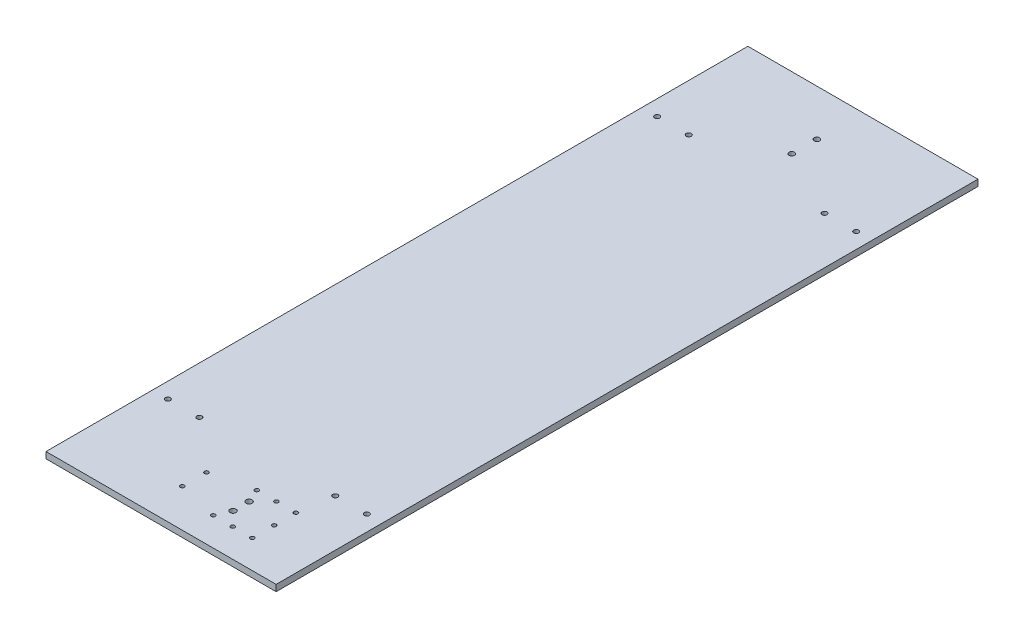
ISO-10303-21;
HEADER;
FILE_DESCRIPTION(('STEP AP214'),'2;1');
FILE_NAME('part.step','',(''),(''),'','','');
FILE_SCHEMA(('AUTOMOTIVE_DESIGN { 1 0 10303 214 1 1 1 1 }'));
ENDSEC;
DATA;
#1=APPLICATION_CONTEXT('core data for automotive mechanical design processes');
#2=APPLICATION_PROTOCOL_DEFINITION('international standard','automotive_design',2000,#1);
#3=PRODUCT_CONTEXT('',#1,'mechanical');
#4=PRODUCT('Part','Part','',(#3));
#5=PRODUCT_RELATED_PRODUCT_CATEGORY('part','',(#4));
#6=PRODUCT_DEFINITION_FORMATION('','',#4);
#7=PRODUCT_DEFINITION_CONTEXT('part definition',#1,'design');
#8=PRODUCT_DEFINITION('design','',#6,#7);
#9=PRODUCT_DEFINITION_SHAPE('','',#8);
#10=(LENGTH_UNIT() NAMED_UNIT(*) SI_UNIT(.MILLI.,.METRE.));
#11=(NAMED_UNIT(*) PLANE_ANGLE_UNIT() SI_UNIT($,.RADIAN.));
#12=(NAMED_UNIT(*) SI_UNIT($,.STERADIAN.) SOLID_ANGLE_UNIT());
#13=UNCERTAINTY_MEASURE_WITH_UNIT(LENGTH_MEASURE(1.E-05),#10,'distance_accuracy_value','');
#14=(GEOMETRIC_REPRESENTATION_CONTEXT(3) GLOBAL_UNCERTAINTY_ASSIGNED_CONTEXT((#13)) GLOBAL_UNIT_ASSIGNED_CONTEXT((#10,
#11,#12)) REPRESENTATION_CONTEXT('',''));
#15=CARTESIAN_POINT('',(0.,0.,0.));
#16=DIRECTION('',(0.,0.,1.));
#17=DIRECTION('',(1.,0.,0.));
#18=AXIS2_PLACEMENT_3D('',#15,#16,#17);
#19=CARTESIAN_POINT('',(-114.75,6.35,-350.));
#20=DIRECTION('',(1.,0.,0.));
#21=DIRECTION('',(0.,0.,-1.));
#22=AXIS2_PLACEMENT_3D('',#19,#20,#21);
#23=PLANE('',#22);
#24=DIRECTION('',(0.,0.,1.));
#25=VECTOR('',#24,1.);
#26=CARTESIAN_POINT('',(-114.75,0.,-350.));
#27=LINE('',#26,#25);
#28=CARTESIAN_POINT('',(-114.75,0.,-350.));
#29=VERTEX_POINT('',#28);
#30=CARTESIAN_POINT('',(-114.75,0.,350.));
#31=VERTEX_POINT('',#30);
#32=EDGE_CURVE('E97',#29,#31,#27,.T.);
#33=ORIENTED_EDGE('',*,*,#32,.T.);
#34=DIRECTION('',(0.,-1.,0.));
#35=VECTOR('',#34,1.);
#36=CARTESIAN_POINT('',(-114.75,6.35,350.));
#37=LINE('',#36,#35);
#38=CARTESIAN_POINT('',(-114.75,6.35,350.));
#39=VERTEX_POINT('',#38);
#40=EDGE_CURVE('E11',#39,#31,#37,.T.);
#41=ORIENTED_EDGE('',*,*,#40,.F.);
#42=DIRECTION('',(0.,0.,1.));
#43=VECTOR('',#42,1.);
#44=CARTESIAN_POINT('',(-114.75,6.35,-350.));
#45=LINE('',#44,#43);
#46=CARTESIAN_POINT('',(-114.75,6.35,-350.));
#47=VERTEX_POINT('',#46);
#48=EDGE_CURVE('E85',#47,#39,#45,.T.);
#49=ORIENTED_EDGE('',*,*,#48,.F.);
#50=DIRECTION('',(0.,-1.,0.));
#51=VECTOR('',#50,1.);
#52=CARTESIAN_POINT('',(-114.75,6.35,-350.));
#53=LINE('',#52,#51);
#54=EDGE_CURVE('E93',#47,#29,#53,.T.);
#55=ORIENTED_EDGE('',*,*,#54,.T.);
#56=EDGE_LOOP('',(#33,#41,#49,#55));
#57=FACE_BOUND('',#56,.T.);
#58=ADVANCED_FACE('F34',(#57),#23,.F.);
#59=CARTESIAN_POINT('',(114.75,6.35,350.));
#60=DIRECTION('',(0.,0.,-1.));
#61=DIRECTION('',(-1.,0.,0.));
#62=AXIS2_PLACEMENT_3D('',#59,#60,#61);
#63=PLANE('',#62);
#64=DIRECTION('',(1.,0.,0.));
#65=VECTOR('',#64,1.);
#66=CARTESIAN_POINT('',(114.75,0.,350.));
#67=LINE('',#66,#65);
#68=CARTESIAN_POINT('',(114.75,0.,350.));
#69=VERTEX_POINT('',#68);
#70=EDGE_CURVE('E89',#31,#69,#67,.T.);
#71=ORIENTED_EDGE('',*,*,#70,.T.);
#72=DIRECTION('',(0.,-1.,0.));
#73=VECTOR('',#72,1.);
#74=CARTESIAN_POINT('',(114.75,6.35,350.));
#75=LINE('',#74,#73);
#76=CARTESIAN_POINT('',(114.75,6.35,350.));
#77=VERTEX_POINT('',#76);
#78=EDGE_CURVE('E42',#77,#69,#75,.T.);
#79=ORIENTED_EDGE('',*,*,#78,.F.);
#80=DIRECTION('',(1.,0.,0.));
#81=VECTOR('',#80,1.);
#82=CARTESIAN_POINT('',(114.75,6.35,350.));
#83=LINE('',#82,#81);
#84=EDGE_CURVE('E80',#39,#77,#83,.T.);
#85=ORIENTED_EDGE('',*,*,#84,.F.);
#86=ORIENTED_EDGE('',*,*,#40,.T.);
#87=EDGE_LOOP('',(#71,#79,#85,#86));
#88=FACE_BOUND('',#87,.T.);
#89=ADVANCED_FACE('F88',(#88),#63,.F.);
#90=CARTESIAN_POINT('',(114.75,6.35,-350.));
#91=DIRECTION('',(-1.,0.,0.));
#92=DIRECTION('',(0.,0.,1.));
#93=AXIS2_PLACEMENT_3D('',#90,#91,#92);
#94=PLANE('',#93);
#95=DIRECTION('',(0.,0.,-1.));
#96=VECTOR('',#95,1.);
#97=CARTESIAN_POINT('',(114.75,0.,-350.));
#98=LINE('',#97,#96);
#99=CARTESIAN_POINT('',(114.75,0.,-350.));
#100=VERTEX_POINT('',#99);
#101=EDGE_CURVE('E67',#69,#100,#98,.T.);
#102=ORIENTED_EDGE('',*,*,#101,.T.);
#103=DIRECTION('',(0.,-1.,0.));
#104=VECTOR('',#103,1.);
#105=CARTESIAN_POINT('',(114.75,6.35,-350.));
#106=LINE('',#105,#104);
#107=CARTESIAN_POINT('',(114.75,6.35,-350.));
#108=VERTEX_POINT('',#107);
#109=EDGE_CURVE('E90',#108,#100,#106,.T.);
#110=ORIENTED_EDGE('',*,*,#109,.F.);
#111=DIRECTION('',(0.,0.,-1.));
#112=VECTOR('',#111,1.);
#113=CARTESIAN_POINT('',(114.75,6.35,-350.));
#114=LINE('',#113,#112);
#115=EDGE_CURVE('E83',#77,#108,#114,.T.);
#116=ORIENTED_EDGE('',*,*,#115,.F.);
#117=ORIENTED_EDGE('',*,*,#78,.T.);
#118=EDGE_LOOP('',(#102,#110,#116,#117));
#119=FACE_BOUND('',#118,.T.);
#120=ADVANCED_FACE('F91',(#119),#94,.F.);
#121=CARTESIAN_POINT('',(114.75,6.35,-350.));
#122=DIRECTION('',(0.,0.,1.));
#123=DIRECTION('',(1.,0.,0.));
#124=AXIS2_PLACEMENT_3D('',#121,#122,#123);
#125=PLANE('',#124);
#126=DIRECTION('',(-1.,0.,0.));
#127=VECTOR('',#126,1.);
#128=CARTESIAN_POINT('',(114.75,0.,-350.));
#129=LINE('',#128,#127);
#130=EDGE_CURVE('E73',#100,#29,#129,.T.);
#131=ORIENTED_EDGE('',*,*,#130,.T.);
#132=ORIENTED_EDGE('',*,*,#54,.F.);
#133=DIRECTION('',(-1.,0.,0.));
#134=VECTOR('',#133,1.);
#135=CARTESIAN_POINT('',(114.75,6.35,-350.));
#136=LINE('',#135,#134);
#137=EDGE_CURVE('E50',#108,#47,#136,.T.);
#138=ORIENTED_EDGE('',*,*,#137,.F.);
#139=ORIENTED_EDGE('',*,*,#109,.T.);
#140=EDGE_LOOP('',(#131,#132,#138,#139));
#141=FACE_BOUND('',#140,.T.);
#142=ADVANCED_FACE('F105',(#141),#125,.F.);
#143=CARTESIAN_POINT('',(0.,6.35,0.));
#144=DIRECTION('',(0.,-1.,0.));
#145=DIRECTION('',(0.,0.,-1.));
#146=AXIS2_PLACEMENT_3D('',#143,#144,#145);
#147=PLANE('',#146);
#148=CARTESIAN_POINT('',(0.,6.35,-279.));
#149=DIRECTION('',(0.,1.,0.));
#150=DIRECTION('',(0.,0.,1.));
#151=AXIS2_PLACEMENT_3D('',#148,#149,#150);
#152=CIRCLE('',#151,2.75);
#153=CARTESIAN_POINT('',(0.,6.35,-276.25));
#154=VERTEX_POINT('',#153);
#155=EDGE_CURVE('E231',#154,#154,#152,.T.);
#156=ORIENTED_EDGE('',*,*,#155,.F.);
#157=EDGE_LOOP('',(#156));
#158=FACE_BOUND('',#157,.T.);
#159=CARTESIAN_POINT('',(0.,6.35,-304.));
#160=DIRECTION('',(0.,1.,0.));
#161=DIRECTION('',(0.,0.,1.));
#162=AXIS2_PLACEMENT_3D('',#159,#160,#161);
#163=CIRCLE('',#162,2.75);
#164=CARTESIAN_POINT('',(0.,6.35,-301.25));
#165=VERTEX_POINT('',#164);
#166=EDGE_CURVE('E225',#165,#165,#163,.T.);
#167=ORIENTED_EDGE('',*,*,#166,.F.);
#168=EDGE_LOOP('',(#167));
#169=FACE_BOUND('',#168,.T.);
#170=CARTESIAN_POINT('',(-67.7499999999988,6.35,-244.));
#171=DIRECTION('',(0.,-1.,0.));
#172=DIRECTION('',(0.,0.,-1.));
#173=AXIS2_PLACEMENT_3D('',#170,#171,#172);
#174=CIRCLE('',#173,2.5);
#175=CARTESIAN_POINT('',(-67.7499999999988,6.35,-246.5));
#176=VERTEX_POINT('',#175);
#177=EDGE_CURVE('E168',#176,#176,#174,.T.);
#178=ORIENTED_EDGE('',*,*,#177,.T.);
#179=EDGE_LOOP('',(#178));
#180=FACE_BOUND('',#179,.T.);
#181=CARTESIAN_POINT('',(-99.2499999999988,6.35,-244.));
#182=DIRECTION('',(0.,-1.,0.));
#183=DIRECTION('',(0.,0.,-1.));
#184=AXIS2_PLACEMENT_3D('',#181,#182,#183);
#185=CIRCLE('',#184,2.50000000000001);
#186=CARTESIAN_POINT('',(-99.2499999999988,6.35,-246.5));
#187=VERTEX_POINT('',#186);
#188=EDGE_CURVE('E175',#187,#187,#185,.T.);
#189=ORIENTED_EDGE('',*,*,#188,.T.);
#190=EDGE_LOOP('',(#189));
#191=FACE_BOUND('',#190,.T.);
#192=CARTESIAN_POINT('',(99.2499999999988,6.35,-244.));
#193=DIRECTION('',(0.,-1.,0.));
#194=DIRECTION('',(0.,0.,1.));
#195=AXIS2_PLACEMENT_3D('',#192,#193,#194);
#196=CIRCLE('',#195,2.50000000000001);
#197=CARTESIAN_POINT('',(99.2499999999988,6.35,-241.5));
#198=VERTEX_POINT('',#197);
#199=EDGE_CURVE('E181',#198,#198,#196,.T.);
#200=ORIENTED_EDGE('',*,*,#199,.T.);
#201=EDGE_LOOP('',(#200));
#202=FACE_BOUND('',#201,.T.);
#203=CARTESIAN_POINT('',(67.7499999999988,6.35,-244.));
#204=DIRECTION('',(0.,-1.,0.));
#205=DIRECTION('',(0.,0.,1.));
#206=AXIS2_PLACEMENT_3D('',#203,#204,#205);
#207=CIRCLE('',#206,2.5);
#208=CARTESIAN_POINT('',(67.7499999999988,6.35,-241.5));
#209=VERTEX_POINT('',#208);
#210=EDGE_CURVE('E187',#209,#209,#207,.T.);
#211=ORIENTED_EDGE('',*,*,#210,.T.);
#212=EDGE_LOOP('',(#211));
#213=FACE_BOUND('',#212,.T.);
#214=CARTESIAN_POINT('',(99.2499999999988,6.35,244.));
#215=DIRECTION('',(0.,-1.,0.));
#216=DIRECTION('',(0.,0.,-1.));
#217=AXIS2_PLACEMENT_3D('',#214,#215,#216);
#218=CIRCLE('',#217,2.50000000000001);
#219=CARTESIAN_POINT('',(99.2499999999988,6.35,241.5));
#220=VERTEX_POINT('',#219);
#221=EDGE_CURVE('E193',#220,#220,#218,.T.);
#222=ORIENTED_EDGE('',*,*,#221,.T.);
#223=EDGE_LOOP('',(#222));
#224=FACE_BOUND('',#223,.T.);
#225=CARTESIAN_POINT('',(67.7499999999988,6.35,244.));
#226=DIRECTION('',(0.,-1.,0.));
#227=DIRECTION('',(0.,0.,-1.));
#228=AXIS2_PLACEMENT_3D('',#225,#226,#227);
#229=CIRCLE('',#228,2.5);
#230=CARTESIAN_POINT('',(67.7499999999988,6.35,241.5));
#231=VERTEX_POINT('',#230);
#232=EDGE_CURVE('E199',#231,#231,#229,.T.);
#233=ORIENTED_EDGE('',*,*,#232,.T.);
#234=EDGE_LOOP('',(#233));
#235=FACE_BOUND('',#234,.T.);
#236=CARTESIAN_POINT('',(29.75,6.35,308.));
#237=DIRECTION('',(0.,-1.,0.));
#238=DIRECTION('',(0.,0.,-1.));
#239=AXIS2_PLACEMENT_3D('',#236,#237,#238);
#240=CIRCLE('',#239,3.);
#241=CARTESIAN_POINT('',(29.75,6.35,305.));
#242=VERTEX_POINT('',#241);
#243=EDGE_CURVE('E205',#242,#242,#240,.T.);
#244=ORIENTED_EDGE('',*,*,#243,.T.);
#245=EDGE_LOOP('',(#244));
#246=FACE_BOUND('',#245,.T.);
#247=CARTESIAN_POINT('',(29.75,6.35,292.));
#248=DIRECTION('',(0.,-1.,0.));
#249=DIRECTION('',(0.,0.,-1.));
#250=AXIS2_PLACEMENT_3D('',#247,#248,#249);
#251=CIRCLE('',#250,3.00000000000001);
#252=CARTESIAN_POINT('',(29.75,6.35,289.));
#253=VERTEX_POINT('',#252);
#254=EDGE_CURVE('E145',#253,#253,#251,.T.);
#255=ORIENTED_EDGE('',*,*,#254,.T.);
#256=EDGE_LOOP('',(#255));
#257=FACE_BOUND('',#256,.T.);
#258=CARTESIAN_POINT('',(-16.75,6.35,288.));
#259=DIRECTION('',(0.,-1.,0.));
#260=DIRECTION('',(0.,0.,-1.));
#261=AXIS2_PLACEMENT_3D('',#258,#259,#260);
#262=CIRCLE('',#261,2.);
#263=CARTESIAN_POINT('',(-16.75,6.35,286.));
#264=VERTEX_POINT('',#263);
#265=EDGE_CURVE('E114',#264,#264,#262,.T.);
#266=ORIENTED_EDGE('',*,*,#265,.T.);
#267=EDGE_LOOP('',(#266));
#268=FACE_BOUND('',#267,.T.);
#269=CARTESIAN_POINT('',(23.75,6.35,321.75));
#270=DIRECTION('',(0.,-1.,0.));
#271=DIRECTION('',(0.,0.,-1.));
#272=AXIS2_PLACEMENT_3D('',#269,#270,#271);
#273=CIRCLE('',#272,2.);
#274=CARTESIAN_POINT('',(23.75,6.35,319.75));
#275=VERTEX_POINT('',#274);
#276=EDGE_CURVE('E133',#275,#275,#273,.T.);
#277=ORIENTED_EDGE('',*,*,#276,.T.);
#278=EDGE_LOOP('',(#277));
#279=FACE_BOUND('',#278,.T.);
#280=CARTESIAN_POINT('',(23.75,6.35,278.25));
#281=DIRECTION('',(0.,-1.,0.));
#282=DIRECTION('',(0.,0.,-1.));
#283=AXIS2_PLACEMENT_3D('',#280,#281,#282);
#284=CIRCLE('',#283,2.);
#285=CARTESIAN_POINT('',(23.75,6.35,276.25));
#286=VERTEX_POINT('',#285);
#287=EDGE_CURVE('E127',#286,#286,#284,.T.);
#288=ORIENTED_EDGE('',*,*,#287,.T.);
#289=EDGE_LOOP('',(#288));
#290=FACE_BOUND('',#289,.T.);
#291=CARTESIAN_POINT('',(43.25,6.35,278.25));
#292=DIRECTION('',(0.,-1.,0.));
#293=DIRECTION('',(0.,0.,-1.));
#294=AXIS2_PLACEMENT_3D('',#291,#292,#293);
#295=CIRCLE('',#294,2.00000000000002);
#296=CARTESIAN_POINT('',(43.25,6.35,276.25));
#297=VERTEX_POINT('',#296);
#298=EDGE_CURVE('E120',#297,#297,#295,.T.);
#299=ORIENTED_EDGE('',*,*,#298,.T.);
#300=EDGE_LOOP('',(#299));
#301=FACE_BOUND('',#300,.T.);
#302=CARTESIAN_POINT('',(43.25,6.35,321.75));
#303=DIRECTION('',(0.,-1.,0.));
#304=DIRECTION('',(0.,0.,-1.));
#305=AXIS2_PLACEMENT_3D('',#302,#303,#304);
#306=CIRCLE('',#305,2.);
#307=CARTESIAN_POINT('',(43.25,6.35,319.75));
#308=VERTEX_POINT('',#307);
#309=EDGE_CURVE('E121',#308,#308,#306,.T.);
#310=ORIENTED_EDGE('',*,*,#309,.T.);
#311=EDGE_LOOP('',(#310));
#312=FACE_BOUND('',#311,.T.);
#313=CARTESIAN_POINT('',(62.75,6.35,321.75));
#314=DIRECTION('',(0.,-1.,0.));
#315=DIRECTION('',(0.,0.,-1.));
#316=AXIS2_PLACEMENT_3D('',#313,#314,#315);
#317=CIRCLE('',#316,1.99999999999998);
#318=CARTESIAN_POINT('',(62.75,6.35,319.75));
#319=VERTEX_POINT('',#318);
#320=EDGE_CURVE('E157',#319,#319,#317,.T.);
#321=ORIENTED_EDGE('',*,*,#320,.T.);
#322=EDGE_LOOP('',(#321));
#323=FACE_BOUND('',#322,.T.);
#324=CARTESIAN_POINT('',(62.75,6.35,300.));
#325=DIRECTION('',(0.,-1.,0.));
#326=DIRECTION('',(0.,0.,-1.));
#327=AXIS2_PLACEMENT_3D('',#324,#325,#326);
#328=CIRCLE('',#327,2.00000000000001);
#329=CARTESIAN_POINT('',(62.75,6.35,298.));
#330=VERTEX_POINT('',#329);
#331=EDGE_CURVE('E151',#330,#330,#328,.T.);
#332=ORIENTED_EDGE('',*,*,#331,.T.);
#333=EDGE_LOOP('',(#332));
#334=FACE_BOUND('',#333,.T.);
#335=CARTESIAN_POINT('',(62.75,6.35,278.25));
#336=DIRECTION('',(0.,-1.,0.));
#337=DIRECTION('',(0.,0.,-1.));
#338=AXIS2_PLACEMENT_3D('',#335,#336,#337);
#339=CIRCLE('',#338,2.);
#340=CARTESIAN_POINT('',(62.75,6.35,276.25));
#341=VERTEX_POINT('',#340);
#342=EDGE_CURVE('E144',#341,#341,#339,.T.);
#343=ORIENTED_EDGE('',*,*,#342,.T.);
#344=EDGE_LOOP('',(#343));
#345=FACE_BOUND('',#344,.T.);
#346=CARTESIAN_POINT('',(-99.2499999999988,6.35,244.));
#347=DIRECTION('',(0.,-1.,0.));
#348=DIRECTION('',(0.,0.,1.));
#349=AXIS2_PLACEMENT_3D('',#346,#347,#348);
#350=CIRCLE('',#349,2.50000000000001);
#351=CARTESIAN_POINT('',(-99.2499999999988,6.35,246.5));
#352=VERTEX_POINT('',#351);
#353=EDGE_CURVE('E169',#352,#352,#350,.T.);
#354=ORIENTED_EDGE('',*,*,#353,.T.);
#355=EDGE_LOOP('',(#354));
#356=FACE_BOUND('',#355,.T.);
#357=CARTESIAN_POINT('',(-67.7499999999988,6.35,244.));
#358=DIRECTION('',(0.,-1.,0.));
#359=DIRECTION('',(0.,0.,1.));
#360=AXIS2_PLACEMENT_3D('',#357,#358,#359);
#361=CIRCLE('',#360,2.5);
#362=CARTESIAN_POINT('',(-67.7499999999988,6.35,246.5));
#363=VERTEX_POINT('',#362);
#364=EDGE_CURVE('E216',#363,#363,#361,.T.);
#365=ORIENTED_EDGE('',*,*,#364,.T.);
#366=EDGE_LOOP('',(#365));
#367=FACE_BOUND('',#366,.T.);
#368=CARTESIAN_POINT('',(-16.75,6.35,312.));
#369=DIRECTION('',(0.,-1.,0.));
#370=DIRECTION('',(0.,0.,-1.));
#371=AXIS2_PLACEMENT_3D('',#368,#369,#370);
#372=CIRCLE('',#371,2.);
#373=CARTESIAN_POINT('',(-16.75,6.35,310.));
#374=VERTEX_POINT('',#373);
#375=EDGE_CURVE('E100',#374,#374,#372,.T.);
#376=ORIENTED_EDGE('',*,*,#375,.T.);
#377=EDGE_LOOP('',(#376));
#378=FACE_BOUND('',#377,.T.);
#379=ORIENTED_EDGE('',*,*,#48,.T.);
#380=ORIENTED_EDGE('',*,*,#84,.T.);
#381=ORIENTED_EDGE('',*,*,#115,.T.);
#382=ORIENTED_EDGE('',*,*,#137,.T.);
#383=EDGE_LOOP('',(#379,#380,#381,#382));
#384=FACE_BOUND('',#383,.T.);
#385=ADVANCED_FACE('F81',(#158,#169,#180,#191,#202,#213,#224,#235,#246,#257,#268,#279,#290,#301,
#312,#323,#334,#345,#356,#367,#378,#384),#147,.F.);
#386=CARTESIAN_POINT('',(0.,0.,0.));
#387=DIRECTION('',(0.,-1.,0.));
#388=DIRECTION('',(0.,0.,-1.));
#389=AXIS2_PLACEMENT_3D('',#386,#387,#388);
#390=PLANE('',#389);
#391=CARTESIAN_POINT('',(0.,0.,-279.));
#392=DIRECTION('',(0.,1.,0.));
#393=DIRECTION('',(0.,0.,1.));
#394=AXIS2_PLACEMENT_3D('',#391,#392,#393);
#395=CIRCLE('',#394,2.75);
#396=CARTESIAN_POINT('',(0.,0.,-276.25));
#397=VERTEX_POINT('',#396);
#398=EDGE_CURVE('E217',#397,#397,#395,.T.);
#399=ORIENTED_EDGE('',*,*,#398,.T.);
#400=EDGE_LOOP('',(#399));
#401=FACE_BOUND('',#400,.T.);
#402=CARTESIAN_POINT('',(0.,0.,-304.));
#403=DIRECTION('',(0.,1.,0.));
#404=DIRECTION('',(0.,0.,1.));
#405=AXIS2_PLACEMENT_3D('',#402,#403,#404);
#406=CIRCLE('',#405,2.75);
#407=CARTESIAN_POINT('',(0.,0.,-301.25));
#408=VERTEX_POINT('',#407);
#409=EDGE_CURVE('E228',#408,#408,#406,.T.);
#410=ORIENTED_EDGE('',*,*,#409,.T.);
#411=EDGE_LOOP('',(#410));
#412=FACE_BOUND('',#411,.T.);
#413=CARTESIAN_POINT('',(-67.7499999999988,0.,-244.));
#414=DIRECTION('',(0.,-1.,0.));
#415=DIRECTION('',(0.,0.,-1.));
#416=AXIS2_PLACEMENT_3D('',#413,#414,#415);
#417=CIRCLE('',#416,2.5);
#418=CARTESIAN_POINT('',(-67.7499999999988,0.,-246.5));
#419=VERTEX_POINT('',#418);
#420=EDGE_CURVE('E165',#419,#419,#417,.T.);
#421=ORIENTED_EDGE('',*,*,#420,.F.);
#422=EDGE_LOOP('',(#421));
#423=FACE_BOUND('',#422,.T.);
#424=CARTESIAN_POINT('',(-99.2499999999988,0.,-244.));
#425=DIRECTION('',(0.,-1.,0.));
#426=DIRECTION('',(0.,0.,-1.));
#427=AXIS2_PLACEMENT_3D('',#424,#425,#426);
#428=CIRCLE('',#427,2.50000000000001);
#429=CARTESIAN_POINT('',(-99.2499999999988,0.,-246.5));
#430=VERTEX_POINT('',#429);
#431=EDGE_CURVE('E172',#430,#430,#428,.T.);
#432=ORIENTED_EDGE('',*,*,#431,.F.);
#433=EDGE_LOOP('',(#432));
#434=FACE_BOUND('',#433,.T.);
#435=CARTESIAN_POINT('',(99.2499999999988,0.,-244.));
#436=DIRECTION('',(0.,-1.,0.));
#437=DIRECTION('',(0.,0.,1.));
#438=AXIS2_PLACEMENT_3D('',#435,#436,#437);
#439=CIRCLE('',#438,2.50000000000001);
#440=CARTESIAN_POINT('',(99.2499999999988,0.,-241.5));
#441=VERTEX_POINT('',#440);
#442=EDGE_CURVE('E178',#441,#441,#439,.T.);
#443=ORIENTED_EDGE('',*,*,#442,.F.);
#444=EDGE_LOOP('',(#443));
#445=FACE_BOUND('',#444,.T.);
#446=CARTESIAN_POINT('',(67.7499999999988,0.,-244.));
#447=DIRECTION('',(0.,-1.,0.));
#448=DIRECTION('',(0.,0.,1.));
#449=AXIS2_PLACEMENT_3D('',#446,#447,#448);
#450=CIRCLE('',#449,2.5);
#451=CARTESIAN_POINT('',(67.7499999999988,0.,-241.5));
#452=VERTEX_POINT('',#451);
#453=EDGE_CURVE('E184',#452,#452,#450,.T.);
#454=ORIENTED_EDGE('',*,*,#453,.F.);
#455=EDGE_LOOP('',(#454));
#456=FACE_BOUND('',#455,.T.);
#457=CARTESIAN_POINT('',(99.2499999999988,0.,244.));
#458=DIRECTION('',(0.,-1.,0.));
#459=DIRECTION('',(0.,0.,-1.));
#460=AXIS2_PLACEMENT_3D('',#457,#458,#459);
#461=CIRCLE('',#460,2.50000000000001);
#462=CARTESIAN_POINT('',(99.2499999999988,0.,241.5));
#463=VERTEX_POINT('',#462);
#464=EDGE_CURVE('E190',#463,#463,#461,.T.);
#465=ORIENTED_EDGE('',*,*,#464,.F.);
#466=EDGE_LOOP('',(#465));
#467=FACE_BOUND('',#466,.T.);
#468=CARTESIAN_POINT('',(67.7499999999988,0.,244.));
#469=DIRECTION('',(0.,-1.,0.));
#470=DIRECTION('',(0.,0.,-1.));
#471=AXIS2_PLACEMENT_3D('',#468,#469,#470);
#472=CIRCLE('',#471,2.5);
#473=CARTESIAN_POINT('',(67.7499999999988,0.,241.5));
#474=VERTEX_POINT('',#473);
#475=EDGE_CURVE('E196',#474,#474,#472,.T.);
#476=ORIENTED_EDGE('',*,*,#475,.F.);
#477=EDGE_LOOP('',(#476));
#478=FACE_BOUND('',#477,.T.);
#479=CARTESIAN_POINT('',(29.75,0.,308.));
#480=DIRECTION('',(0.,-1.,0.));
#481=DIRECTION('',(0.,0.,-1.));
#482=AXIS2_PLACEMENT_3D('',#479,#480,#481);
#483=CIRCLE('',#482,3.);
#484=CARTESIAN_POINT('',(29.75,0.,305.));
#485=VERTEX_POINT('',#484);
#486=EDGE_CURVE('E202',#485,#485,#483,.T.);
#487=ORIENTED_EDGE('',*,*,#486,.F.);
#488=EDGE_LOOP('',(#487));
#489=FACE_BOUND('',#488,.T.);
#490=CARTESIAN_POINT('',(29.75,0.,292.));
#491=DIRECTION('',(0.,-1.,0.));
#492=DIRECTION('',(0.,0.,-1.));
#493=AXIS2_PLACEMENT_3D('',#490,#491,#492);
#494=CIRCLE('',#493,3.00000000000001);
#495=CARTESIAN_POINT('',(29.75,0.,289.));
#496=VERTEX_POINT('',#495);
#497=EDGE_CURVE('E208',#496,#496,#494,.T.);
#498=ORIENTED_EDGE('',*,*,#497,.F.);
#499=EDGE_LOOP('',(#498));
#500=FACE_BOUND('',#499,.T.);
#501=CARTESIAN_POINT('',(-16.75,0.,288.));
#502=DIRECTION('',(0.,-1.,0.));
#503=DIRECTION('',(0.,0.,-1.));
#504=AXIS2_PLACEMENT_3D('',#501,#502,#503);
#505=CIRCLE('',#504,2.);
#506=CARTESIAN_POINT('',(-16.75,0.,286.));
#507=VERTEX_POINT('',#506);
#508=EDGE_CURVE('E136',#507,#507,#505,.T.);
#509=ORIENTED_EDGE('',*,*,#508,.F.);
#510=EDGE_LOOP('',(#509));
#511=FACE_BOUND('',#510,.T.);
#512=CARTESIAN_POINT('',(23.75,0.,321.75));
#513=DIRECTION('',(0.,-1.,0.));
#514=DIRECTION('',(0.,0.,-1.));
#515=AXIS2_PLACEMENT_3D('',#512,#513,#514);
#516=CIRCLE('',#515,2.);
#517=CARTESIAN_POINT('',(23.75,0.,319.75));
#518=VERTEX_POINT('',#517);
#519=EDGE_CURVE('E130',#518,#518,#516,.T.);
#520=ORIENTED_EDGE('',*,*,#519,.F.);
#521=EDGE_LOOP('',(#520));
#522=FACE_BOUND('',#521,.T.);
#523=CARTESIAN_POINT('',(23.75,0.,278.25));
#524=DIRECTION('',(0.,-1.,0.));
#525=DIRECTION('',(0.,0.,-1.));
#526=AXIS2_PLACEMENT_3D('',#523,#524,#525);
#527=CIRCLE('',#526,2.);
#528=CARTESIAN_POINT('',(23.75,0.,276.25));
#529=VERTEX_POINT('',#528);
#530=EDGE_CURVE('E124',#529,#529,#527,.T.);
#531=ORIENTED_EDGE('',*,*,#530,.F.);
#532=EDGE_LOOP('',(#531));
#533=FACE_BOUND('',#532,.T.);
#534=CARTESIAN_POINT('',(43.25,0.,278.25));
#535=DIRECTION('',(0.,-1.,0.));
#536=DIRECTION('',(0.,0.,-1.));
#537=AXIS2_PLACEMENT_3D('',#534,#535,#536);
#538=CIRCLE('',#537,2.00000000000002);
#539=CARTESIAN_POINT('',(43.25,0.,276.25));
#540=VERTEX_POINT('',#539);
#541=EDGE_CURVE('E117',#540,#540,#538,.T.);
#542=ORIENTED_EDGE('',*,*,#541,.F.);
#543=EDGE_LOOP('',(#542));
#544=FACE_BOUND('',#543,.T.);
#545=CARTESIAN_POINT('',(43.25,0.,321.75));
#546=DIRECTION('',(0.,-1.,0.));
#547=DIRECTION('',(0.,0.,-1.));
#548=AXIS2_PLACEMENT_3D('',#545,#546,#547);
#549=CIRCLE('',#548,2.);
#550=CARTESIAN_POINT('',(43.25,0.,319.75));
#551=VERTEX_POINT('',#550);
#552=EDGE_CURVE('E160',#551,#551,#549,.T.);
#553=ORIENTED_EDGE('',*,*,#552,.F.);
#554=EDGE_LOOP('',(#553));
#555=FACE_BOUND('',#554,.T.);
#556=CARTESIAN_POINT('',(62.75,0.,321.75));
#557=DIRECTION('',(0.,-1.,0.));
#558=DIRECTION('',(0.,0.,-1.));
#559=AXIS2_PLACEMENT_3D('',#556,#557,#558);
#560=CIRCLE('',#559,1.99999999999998);
#561=CARTESIAN_POINT('',(62.75,0.,319.75));
#562=VERTEX_POINT('',#561);
#563=EDGE_CURVE('E154',#562,#562,#560,.T.);
#564=ORIENTED_EDGE('',*,*,#563,.F.);
#565=EDGE_LOOP('',(#564));
#566=FACE_BOUND('',#565,.T.);
#567=CARTESIAN_POINT('',(62.75,0.,300.));
#568=DIRECTION('',(0.,-1.,0.));
#569=DIRECTION('',(0.,0.,-1.));
#570=AXIS2_PLACEMENT_3D('',#567,#568,#569);
#571=CIRCLE('',#570,2.00000000000001);
#572=CARTESIAN_POINT('',(62.75,0.,298.));
#573=VERTEX_POINT('',#572);
#574=EDGE_CURVE('E148',#573,#573,#571,.T.);
#575=ORIENTED_EDGE('',*,*,#574,.F.);
#576=EDGE_LOOP('',(#575));
#577=FACE_BOUND('',#576,.T.);
#578=CARTESIAN_POINT('',(62.75,0.,278.25));
#579=DIRECTION('',(0.,-1.,0.));
#580=DIRECTION('',(0.,0.,-1.));
#581=AXIS2_PLACEMENT_3D('',#578,#579,#580);
#582=CIRCLE('',#581,2.);
#583=CARTESIAN_POINT('',(62.75,0.,276.25));
#584=VERTEX_POINT('',#583);
#585=EDGE_CURVE('E141',#584,#584,#582,.T.);
#586=ORIENTED_EDGE('',*,*,#585,.F.);
#587=EDGE_LOOP('',(#586));
#588=FACE_BOUND('',#587,.T.);
#589=CARTESIAN_POINT('',(-99.2499999999988,0.,244.));
#590=DIRECTION('',(0.,-1.,0.));
#591=DIRECTION('',(0.,0.,1.));
#592=AXIS2_PLACEMENT_3D('',#589,#590,#591);
#593=CIRCLE('',#592,2.50000000000001);
#594=CARTESIAN_POINT('',(-99.2499999999988,0.,246.5));
#595=VERTEX_POINT('',#594);
#596=EDGE_CURVE('E220',#595,#595,#593,.T.);
#597=ORIENTED_EDGE('',*,*,#596,.F.);
#598=EDGE_LOOP('',(#597));
#599=FACE_BOUND('',#598,.T.);
#600=CARTESIAN_POINT('',(-67.7499999999988,0.,244.));
#601=DIRECTION('',(0.,-1.,0.));
#602=DIRECTION('',(0.,0.,1.));
#603=AXIS2_PLACEMENT_3D('',#600,#601,#602);
#604=CIRCLE('',#603,2.5);
#605=CARTESIAN_POINT('',(-67.7499999999988,0.,246.5));
#606=VERTEX_POINT('',#605);
#607=EDGE_CURVE('E213',#606,#606,#604,.T.);
#608=ORIENTED_EDGE('',*,*,#607,.F.);
#609=EDGE_LOOP('',(#608));
#610=FACE_BOUND('',#609,.T.);
#611=CARTESIAN_POINT('',(-16.75,0.,312.));
#612=DIRECTION('',(0.,-1.,0.));
#613=DIRECTION('',(0.,0.,-1.));
#614=AXIS2_PLACEMENT_3D('',#611,#612,#613);
#615=CIRCLE('',#614,2.);
#616=CARTESIAN_POINT('',(-16.75,0.,310.));
#617=VERTEX_POINT('',#616);
#618=EDGE_CURVE('E111',#617,#617,#615,.T.);
#619=ORIENTED_EDGE('',*,*,#618,.F.);
#620=EDGE_LOOP('',(#619));
#621=FACE_BOUND('',#620,.T.);
#622=ORIENTED_EDGE('',*,*,#32,.F.);
#623=ORIENTED_EDGE('',*,*,#130,.F.);
#624=ORIENTED_EDGE('',*,*,#101,.F.);
#625=ORIENTED_EDGE('',*,*,#70,.F.);
#626=EDGE_LOOP('',(#622,#623,#624,#625));
#627=FACE_BOUND('',#626,.T.);
#628=ADVANCED_FACE('F108',(#401,#412,#423,#434,#445,#456,#467,#478,#489,#500,#511,#522,#533,
#544,#555,#566,#577,#588,#599,#610,#621,#627),#390,.T.);
#629=CARTESIAN_POINT('',(-16.75,6.35,312.));
#630=DIRECTION('',(0.,-1.,0.));
#631=DIRECTION('',(0.,0.,-1.));
#632=AXIS2_PLACEMENT_3D('',#629,#630,#631);
#633=CYLINDRICAL_SURFACE('',#632,2.);
#634=ORIENTED_EDGE('',*,*,#375,.F.);
#635=EDGE_LOOP('',(#634));
#636=FACE_BOUND('',#635,.T.);
#637=ORIENTED_EDGE('',*,*,#618,.T.);
#638=EDGE_LOOP('',(#637));
#639=FACE_BOUND('',#638,.T.);
#640=ADVANCED_FACE('F289',(#636,#639),#633,.F.);
#641=CARTESIAN_POINT('',(-67.7499999999988,6.35,244.));
#642=DIRECTION('',(0.,-1.,0.));
#643=DIRECTION('',(0.,0.,-1.));
#644=AXIS2_PLACEMENT_3D('',#641,#642,#643);
#645=CYLINDRICAL_SURFACE('',#644,2.5);
#646=ORIENTED_EDGE('',*,*,#364,.F.);
#647=EDGE_LOOP('',(#646));
#648=FACE_BOUND('',#647,.T.);
#649=ORIENTED_EDGE('',*,*,#607,.T.);
#650=EDGE_LOOP('',(#649));
#651=FACE_BOUND('',#650,.T.);
#652=ADVANCED_FACE('F292',(#648,#651),#645,.F.);
#653=CARTESIAN_POINT('',(-99.2499999999988,6.35,244.));
#654=DIRECTION('',(0.,-1.,0.));
#655=DIRECTION('',(0.,0.,-1.));
#656=AXIS2_PLACEMENT_3D('',#653,#654,#655);
#657=CYLINDRICAL_SURFACE('',#656,2.50000000000001);
#658=ORIENTED_EDGE('',*,*,#353,.F.);
#659=EDGE_LOOP('',(#658));
#660=FACE_BOUND('',#659,.T.);
#661=ORIENTED_EDGE('',*,*,#596,.T.);
#662=EDGE_LOOP('',(#661));
#663=FACE_BOUND('',#662,.T.);
#664=ADVANCED_FACE('F468',(#660,#663),#657,.F.);
#665=CARTESIAN_POINT('',(62.75,6.35,278.25));
#666=DIRECTION('',(0.,-1.,0.));
#667=DIRECTION('',(0.,0.,-1.));
#668=AXIS2_PLACEMENT_3D('',#665,#666,#667);
#669=CYLINDRICAL_SURFACE('',#668,2.);
#670=ORIENTED_EDGE('',*,*,#342,.F.);
#671=EDGE_LOOP('',(#670));
#672=FACE_BOUND('',#671,.T.);
#673=ORIENTED_EDGE('',*,*,#585,.T.);
#674=EDGE_LOOP('',(#673));
#675=FACE_BOUND('',#674,.T.);
#676=ADVANCED_FACE('F460',(#672,#675),#669,.F.);
#677=CARTESIAN_POINT('',(62.75,6.35,300.));
#678=DIRECTION('',(0.,-1.,0.));
#679=DIRECTION('',(0.,0.,-1.));
#680=AXIS2_PLACEMENT_3D('',#677,#678,#679);
#681=CYLINDRICAL_SURFACE('',#680,2.00000000000001);
#682=ORIENTED_EDGE('',*,*,#331,.F.);
#683=EDGE_LOOP('',(#682));
#684=FACE_BOUND('',#683,.T.);
#685=ORIENTED_EDGE('',*,*,#574,.T.);
#686=EDGE_LOOP('',(#685));
#687=FACE_BOUND('',#686,.T.);
#688=ADVANCED_FACE('F452',(#684,#687),#681,.F.);
#689=CARTESIAN_POINT('',(62.75,6.35,321.75));
#690=DIRECTION('',(0.,-1.,0.));
#691=DIRECTION('',(0.,0.,-1.));
#692=AXIS2_PLACEMENT_3D('',#689,#690,#691);
#693=CYLINDRICAL_SURFACE('',#692,1.99999999999998);
#694=ORIENTED_EDGE('',*,*,#320,.F.);
#695=EDGE_LOOP('',(#694));
#696=FACE_BOUND('',#695,.T.);
#697=ORIENTED_EDGE('',*,*,#563,.T.);
#698=EDGE_LOOP('',(#697));
#699=FACE_BOUND('',#698,.T.);
#700=ADVANCED_FACE('F444',(#696,#699),#693,.F.);
#701=CARTESIAN_POINT('',(43.25,6.35,321.75));
#702=DIRECTION('',(0.,-1.,0.));
#703=DIRECTION('',(0.,0.,-1.));
#704=AXIS2_PLACEMENT_3D('',#701,#702,#703);
#705=CYLINDRICAL_SURFACE('',#704,2.);
#706=ORIENTED_EDGE('',*,*,#309,.F.);
#707=EDGE_LOOP('',(#706));
#708=FACE_BOUND('',#707,.T.);
#709=ORIENTED_EDGE('',*,*,#552,.T.);
#710=EDGE_LOOP('',(#709));
#711=FACE_BOUND('',#710,.T.);
#712=ADVANCED_FACE('F436',(#708,#711),#705,.F.);
#713=CARTESIAN_POINT('',(43.25,6.35,278.25));
#714=DIRECTION('',(0.,-1.,0.));
#715=DIRECTION('',(0.,0.,-1.));
#716=AXIS2_PLACEMENT_3D('',#713,#714,#715);
#717=CYLINDRICAL_SURFACE('',#716,2.00000000000002);
#718=ORIENTED_EDGE('',*,*,#298,.F.);
#719=EDGE_LOOP('',(#718));
#720=FACE_BOUND('',#719,.T.);
#721=ORIENTED_EDGE('',*,*,#541,.T.);
#722=EDGE_LOOP('',(#721));
#723=FACE_BOUND('',#722,.T.);
#724=ADVANCED_FACE('F428',(#720,#723),#717,.F.);
#725=CARTESIAN_POINT('',(23.75,6.35,278.25));
#726=DIRECTION('',(0.,-1.,0.));
#727=DIRECTION('',(0.,0.,-1.));
#728=AXIS2_PLACEMENT_3D('',#725,#726,#727);
#729=CYLINDRICAL_SURFACE('',#728,2.);
#730=ORIENTED_EDGE('',*,*,#287,.F.);
#731=EDGE_LOOP('',(#730));
#732=FACE_BOUND('',#731,.T.);
#733=ORIENTED_EDGE('',*,*,#530,.T.);
#734=EDGE_LOOP('',(#733));
#735=FACE_BOUND('',#734,.T.);
#736=ADVANCED_FACE('F420',(#732,#735),#729,.F.);
#737=CARTESIAN_POINT('',(23.75,6.35,321.75));
#738=DIRECTION('',(0.,-1.,0.));
#739=DIRECTION('',(0.,0.,-1.));
#740=AXIS2_PLACEMENT_3D('',#737,#738,#739);
#741=CYLINDRICAL_SURFACE('',#740,2.);
#742=ORIENTED_EDGE('',*,*,#276,.F.);
#743=EDGE_LOOP('',(#742));
#744=FACE_BOUND('',#743,.T.);
#745=ORIENTED_EDGE('',*,*,#519,.T.);
#746=EDGE_LOOP('',(#745));
#747=FACE_BOUND('',#746,.T.);
#748=ADVANCED_FACE('F412',(#744,#747),#741,.F.);
#749=CARTESIAN_POINT('',(-16.75,6.35,288.));
#750=DIRECTION('',(0.,-1.,0.));
#751=DIRECTION('',(0.,0.,-1.));
#752=AXIS2_PLACEMENT_3D('',#749,#750,#751);
#753=CYLINDRICAL_SURFACE('',#752,2.);
#754=ORIENTED_EDGE('',*,*,#265,.F.);
#755=EDGE_LOOP('',(#754));
#756=FACE_BOUND('',#755,.T.);
#757=ORIENTED_EDGE('',*,*,#508,.T.);
#758=EDGE_LOOP('',(#757));
#759=FACE_BOUND('',#758,.T.);
#760=ADVANCED_FACE('F404',(#756,#759),#753,.F.);
#761=CARTESIAN_POINT('',(29.75,6.35,292.));
#762=DIRECTION('',(0.,-1.,0.));
#763=DIRECTION('',(0.,0.,-1.));
#764=AXIS2_PLACEMENT_3D('',#761,#762,#763);
#765=CYLINDRICAL_SURFACE('',#764,3.00000000000001);
#766=ORIENTED_EDGE('',*,*,#254,.F.);
#767=EDGE_LOOP('',(#766));
#768=FACE_BOUND('',#767,.T.);
#769=ORIENTED_EDGE('',*,*,#497,.T.);
#770=EDGE_LOOP('',(#769));
#771=FACE_BOUND('',#770,.T.);
#772=ADVANCED_FACE('F396',(#768,#771),#765,.F.);
#773=CARTESIAN_POINT('',(29.75,6.35,308.));
#774=DIRECTION('',(0.,-1.,0.));
#775=DIRECTION('',(0.,0.,-1.));
#776=AXIS2_PLACEMENT_3D('',#773,#774,#775);
#777=CYLINDRICAL_SURFACE('',#776,3.);
#778=ORIENTED_EDGE('',*,*,#243,.F.);
#779=EDGE_LOOP('',(#778));
#780=FACE_BOUND('',#779,.T.);
#781=ORIENTED_EDGE('',*,*,#486,.T.);
#782=EDGE_LOOP('',(#781));
#783=FACE_BOUND('',#782,.T.);
#784=ADVANCED_FACE('F388',(#780,#783),#777,.F.);
#785=CARTESIAN_POINT('',(67.7499999999988,6.35,244.));
#786=DIRECTION('',(0.,-1.,0.));
#787=DIRECTION('',(0.,0.,-1.));
#788=AXIS2_PLACEMENT_3D('',#785,#786,#787);
#789=CYLINDRICAL_SURFACE('',#788,2.5);
#790=ORIENTED_EDGE('',*,*,#232,.F.);
#791=EDGE_LOOP('',(#790));
#792=FACE_BOUND('',#791,.T.);
#793=ORIENTED_EDGE('',*,*,#475,.T.);
#794=EDGE_LOOP('',(#793));
#795=FACE_BOUND('',#794,.T.);
#796=ADVANCED_FACE('F380',(#792,#795),#789,.F.);
#797=CARTESIAN_POINT('',(99.2499999999988,6.35,244.));
#798=DIRECTION('',(0.,-1.,0.));
#799=DIRECTION('',(0.,0.,-1.));
#800=AXIS2_PLACEMENT_3D('',#797,#798,#799);
#801=CYLINDRICAL_SURFACE('',#800,2.50000000000001);
#802=ORIENTED_EDGE('',*,*,#221,.F.);
#803=EDGE_LOOP('',(#802));
#804=FACE_BOUND('',#803,.T.);
#805=ORIENTED_EDGE('',*,*,#464,.T.);
#806=EDGE_LOOP('',(#805));
#807=FACE_BOUND('',#806,.T.);
#808=ADVANCED_FACE('F372',(#804,#807),#801,.F.);
#809=CARTESIAN_POINT('',(67.7499999999988,6.35,-244.));
#810=DIRECTION('',(0.,-1.,0.));
#811=DIRECTION('',(0.,0.,-1.));
#812=AXIS2_PLACEMENT_3D('',#809,#810,#811);
#813=CYLINDRICAL_SURFACE('',#812,2.5);
#814=ORIENTED_EDGE('',*,*,#210,.F.);
#815=EDGE_LOOP('',(#814));
#816=FACE_BOUND('',#815,.T.);
#817=ORIENTED_EDGE('',*,*,#453,.T.);
#818=EDGE_LOOP('',(#817));
#819=FACE_BOUND('',#818,.T.);
#820=ADVANCED_FACE('F364',(#816,#819),#813,.F.);
#821=CARTESIAN_POINT('',(99.2499999999988,6.35,-244.));
#822=DIRECTION('',(0.,-1.,0.));
#823=DIRECTION('',(0.,0.,-1.));
#824=AXIS2_PLACEMENT_3D('',#821,#822,#823);
#825=CYLINDRICAL_SURFACE('',#824,2.50000000000001);
#826=ORIENTED_EDGE('',*,*,#199,.F.);
#827=EDGE_LOOP('',(#826));
#828=FACE_BOUND('',#827,.T.);
#829=ORIENTED_EDGE('',*,*,#442,.T.);
#830=EDGE_LOOP('',(#829));
#831=FACE_BOUND('',#830,.T.);
#832=ADVANCED_FACE('F356',(#828,#831),#825,.F.);
#833=CARTESIAN_POINT('',(-99.2499999999988,6.35,-244.));
#834=DIRECTION('',(0.,-1.,0.));
#835=DIRECTION('',(0.,0.,-1.));
#836=AXIS2_PLACEMENT_3D('',#833,#834,#835);
#837=CYLINDRICAL_SURFACE('',#836,2.50000000000001);
#838=ORIENTED_EDGE('',*,*,#188,.F.);
#839=EDGE_LOOP('',(#838));
#840=FACE_BOUND('',#839,.T.);
#841=ORIENTED_EDGE('',*,*,#431,.T.);
#842=EDGE_LOOP('',(#841));
#843=FACE_BOUND('',#842,.T.);
#844=ADVANCED_FACE('F351',(#840,#843),#837,.F.);
#845=CARTESIAN_POINT('',(-67.7499999999988,6.35,-244.));
#846=DIRECTION('',(0.,-1.,0.));
#847=DIRECTION('',(0.,0.,-1.));
#848=AXIS2_PLACEMENT_3D('',#845,#846,#847);
#849=CYLINDRICAL_SURFACE('',#848,2.5);
#850=ORIENTED_EDGE('',*,*,#177,.F.);
#851=EDGE_LOOP('',(#850));
#852=FACE_BOUND('',#851,.T.);
#853=ORIENTED_EDGE('',*,*,#420,.T.);
#854=EDGE_LOOP('',(#853));
#855=FACE_BOUND('',#854,.T.);
#856=ADVANCED_FACE('F325',(#852,#855),#849,.F.);
#857=CARTESIAN_POINT('',(0.,0.,-304.));
#858=DIRECTION('',(0.,1.,0.));
#859=DIRECTION('',(0.,0.,1.));
#860=AXIS2_PLACEMENT_3D('',#857,#858,#859);
#861=CYLINDRICAL_SURFACE('',#860,2.75);
#862=ORIENTED_EDGE('',*,*,#409,.F.);
#863=EDGE_LOOP('',(#862));
#864=FACE_BOUND('',#863,.T.);
#865=ORIENTED_EDGE('',*,*,#166,.T.);
#866=EDGE_LOOP('',(#865));
#867=FACE_BOUND('',#866,.T.);
#868=ADVANCED_FACE('F242',(#864,#867),#861,.F.);
#869=CARTESIAN_POINT('',(0.,0.,-279.));
#870=DIRECTION('',(0.,1.,0.));
#871=DIRECTION('',(0.,0.,1.));
#872=AXIS2_PLACEMENT_3D('',#869,#870,#871);
#873=CYLINDRICAL_SURFACE('',#872,2.75);
#874=ORIENTED_EDGE('',*,*,#398,.F.);
#875=EDGE_LOOP('',(#874));
#876=FACE_BOUND('',#875,.T.);
#877=ORIENTED_EDGE('',*,*,#155,.T.);
#878=EDGE_LOOP('',(#877));
#879=FACE_BOUND('',#878,.T.);
#880=ADVANCED_FACE('F239',(#876,#879),#873,.F.);
#881=CLOSED_SHELL('',(#58,#89,#120,#142,#385,#628,#640,#652,#664,#676,#688,#700,#712,#724,#736,
#748,#760,#772,#784,#796,#808,#820,#832,#844,#856,#868,#880));
#882=MANIFOLD_SOLID_BREP('B2',#881);
#883=ADVANCED_BREP_SHAPE_REPRESENTATION('',(#18,#882),#14);
#884=SHAPE_DEFINITION_REPRESENTATION(#9,#883);
ENDSEC;
END-ISO-10303-21;
